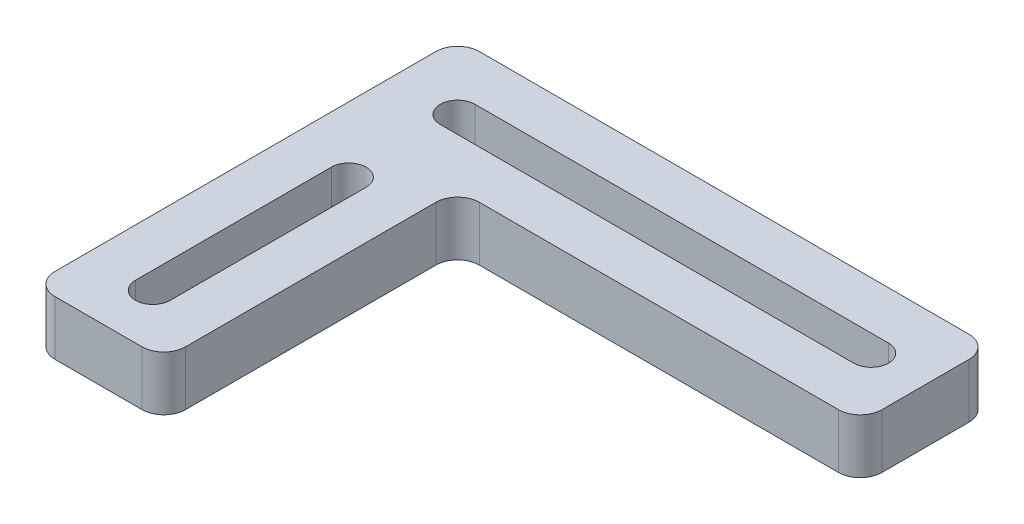
ISO-10303-21;
HEADER;
FILE_DESCRIPTION(('STEP AP214'),'2;1');
FILE_NAME('part.step','',(''),(''),'','','');
FILE_SCHEMA(('AUTOMOTIVE_DESIGN { 1 0 10303 214 1 1 1 1 }'));
ENDSEC;
DATA;
#1=APPLICATION_CONTEXT('core data for automotive mechanical design processes');
#2=APPLICATION_PROTOCOL_DEFINITION('international standard','automotive_design',2000,#1);
#3=PRODUCT_CONTEXT('',#1,'mechanical');
#4=PRODUCT('Part','Part','',(#3));
#5=PRODUCT_RELATED_PRODUCT_CATEGORY('part','',(#4));
#6=PRODUCT_DEFINITION_FORMATION('','',#4);
#7=PRODUCT_DEFINITION_CONTEXT('part definition',#1,'design');
#8=PRODUCT_DEFINITION('design','',#6,#7);
#9=PRODUCT_DEFINITION_SHAPE('','',#8);
#10=(LENGTH_UNIT() NAMED_UNIT(*) SI_UNIT(.MILLI.,.METRE.));
#11=(NAMED_UNIT(*) PLANE_ANGLE_UNIT() SI_UNIT($,.RADIAN.));
#12=(NAMED_UNIT(*) SI_UNIT($,.STERADIAN.) SOLID_ANGLE_UNIT());
#13=UNCERTAINTY_MEASURE_WITH_UNIT(LENGTH_MEASURE(1.E-05),#10,'distance_accuracy_value','');
#14=(GEOMETRIC_REPRESENTATION_CONTEXT(3) GLOBAL_UNCERTAINTY_ASSIGNED_CONTEXT((#13)) GLOBAL_UNIT_ASSIGNED_CONTEXT((#10,
#11,#12)) REPRESENTATION_CONTEXT('',''));
#15=CARTESIAN_POINT('',(0.,0.,0.));
#16=DIRECTION('',(0.,0.,1.));
#17=DIRECTION('',(1.,0.,0.));
#18=AXIS2_PLACEMENT_3D('',#15,#16,#17);
#19=CARTESIAN_POINT('',(0.,5.,-37.));
#20=DIRECTION('',(0.,0.,-1.));
#21=DIRECTION('',(-1.,0.,0.));
#22=AXIS2_PLACEMENT_3D('',#19,#20,#21);
#23=PLANE('',#22);
#24=DIRECTION('',(1.,0.,0.));
#25=VECTOR('',#24,1.);
#26=CARTESIAN_POINT('',(0.,0.,-37.));
#27=LINE('',#26,#25);
#28=CARTESIAN_POINT('',(0.,0.,-37.));
#29=VERTEX_POINT('',#28);
#30=CARTESIAN_POINT('',(45.,0.,-37.));
#31=VERTEX_POINT('',#30);
#32=EDGE_CURVE('E231',#29,#31,#27,.T.);
#33=ORIENTED_EDGE('',*,*,#32,.F.);
#34=DIRECTION('',(0.,-1.,0.));
#35=VECTOR('',#34,1.);
#36=CARTESIAN_POINT('',(0.,5.,-37.));
#37=LINE('',#36,#35);
#38=CARTESIAN_POINT('',(0.,5.,-37.));
#39=VERTEX_POINT('',#38);
#40=EDGE_CURVE('E11',#39,#29,#37,.T.);
#41=ORIENTED_EDGE('',*,*,#40,.F.);
#42=DIRECTION('',(1.,0.,0.));
#43=VECTOR('',#42,1.);
#44=CARTESIAN_POINT('',(0.,5.,-37.));
#45=LINE('',#44,#43);
#46=CARTESIAN_POINT('',(45.,5.,-37.));
#47=VERTEX_POINT('',#46);
#48=EDGE_CURVE('E332',#39,#47,#45,.T.);
#49=ORIENTED_EDGE('',*,*,#48,.T.);
#50=DIRECTION('',(0.,-1.,0.));
#51=VECTOR('',#50,1.);
#52=CARTESIAN_POINT('',(45.,5.,-37.));
#53=LINE('',#52,#51);
#54=EDGE_CURVE('E123',#47,#31,#53,.T.);
#55=ORIENTED_EDGE('',*,*,#54,.T.);
#56=EDGE_LOOP('',(#33,#41,#49,#55));
#57=FACE_BOUND('',#56,.T.);
#58=ADVANCED_FACE('F34',(#57),#23,.T.);
#59=CARTESIAN_POINT('',(0.,5.,-35.));
#60=DIRECTION('',(0.,-1.,0.));
#61=DIRECTION('',(0.,0.,-1.));
#62=AXIS2_PLACEMENT_3D('',#59,#60,#61);
#63=CYLINDRICAL_SURFACE('',#62,2.);
#64=CARTESIAN_POINT('',(0.,0.,-35.));
#65=DIRECTION('',(0.,1.,0.));
#66=DIRECTION('',(0.,0.,1.));
#67=AXIS2_PLACEMENT_3D('',#64,#65,#66);
#68=CIRCLE('',#67,2.);
#69=CARTESIAN_POINT('',(-1.99999999999999,0.,-35.));
#70=VERTEX_POINT('',#69);
#71=EDGE_CURVE('E234',#29,#70,#68,.T.);
#72=ORIENTED_EDGE('',*,*,#71,.T.);
#73=DIRECTION('',(0.,-1.,0.));
#74=VECTOR('',#73,1.);
#75=CARTESIAN_POINT('',(-1.99999999999999,5.,-35.));
#76=LINE('',#75,#74);
#77=CARTESIAN_POINT('',(-1.99999999999999,5.,-35.));
#78=VERTEX_POINT('',#77);
#79=EDGE_CURVE('E44',#78,#70,#76,.T.);
#80=ORIENTED_EDGE('',*,*,#79,.F.);
#81=CARTESIAN_POINT('',(0.,5.,-35.));
#82=DIRECTION('',(0.,1.,0.));
#83=DIRECTION('',(0.,0.,1.));
#84=AXIS2_PLACEMENT_3D('',#81,#82,#83);
#85=CIRCLE('',#84,2.);
#86=EDGE_CURVE('E334',#39,#78,#85,.T.);
#87=ORIENTED_EDGE('',*,*,#86,.F.);
#88=ORIENTED_EDGE('',*,*,#40,.T.);
#89=EDGE_LOOP('',(#72,#80,#87,#88));
#90=FACE_BOUND('',#89,.T.);
#91=ADVANCED_FACE('F364',(#90),#63,.T.);
#92=CARTESIAN_POINT('',(-1.99999999999999,5.,0.));
#93=DIRECTION('',(-1.,0.,0.));
#94=DIRECTION('',(0.,0.,1.));
#95=AXIS2_PLACEMENT_3D('',#92,#93,#94);
#96=PLANE('',#95);
#97=DIRECTION('',(0.,0.,-1.));
#98=VECTOR('',#97,1.);
#99=CARTESIAN_POINT('',(-1.99999999999999,0.,0.));
#100=LINE('',#99,#98);
#101=CARTESIAN_POINT('',(-1.99999999999999,0.,0.));
#102=VERTEX_POINT('',#101);
#103=EDGE_CURVE('E237',#102,#70,#100,.T.);
#104=ORIENTED_EDGE('',*,*,#103,.F.);
#105=DIRECTION('',(0.,-1.,0.));
#106=VECTOR('',#105,1.);
#107=CARTESIAN_POINT('',(-1.99999999999999,5.,0.));
#108=LINE('',#107,#106);
#109=CARTESIAN_POINT('',(-1.99999999999999,5.,0.));
#110=VERTEX_POINT('',#109);
#111=EDGE_CURVE('E280',#110,#102,#108,.T.);
#112=ORIENTED_EDGE('',*,*,#111,.F.);
#113=DIRECTION('',(0.,0.,-1.));
#114=VECTOR('',#113,1.);
#115=CARTESIAN_POINT('',(-1.99999999999999,5.,0.));
#116=LINE('',#115,#114);
#117=EDGE_CURVE('E336',#110,#78,#116,.T.);
#118=ORIENTED_EDGE('',*,*,#117,.T.);
#119=ORIENTED_EDGE('',*,*,#79,.T.);
#120=EDGE_LOOP('',(#104,#112,#118,#119));
#121=FACE_BOUND('',#120,.T.);
#122=ADVANCED_FACE('F367',(#121),#96,.T.);
#123=CARTESIAN_POINT('',(0.,5.,0.));
#124=DIRECTION('',(0.,-1.,0.));
#125=DIRECTION('',(0.,0.,-1.));
#126=AXIS2_PLACEMENT_3D('',#123,#124,#125);
#127=CYLINDRICAL_SURFACE('',#126,2.);
#128=CARTESIAN_POINT('',(0.,0.,0.));
#129=DIRECTION('',(0.,1.,0.));
#130=DIRECTION('',(0.,0.,1.));
#131=AXIS2_PLACEMENT_3D('',#128,#129,#130);
#132=CIRCLE('',#131,2.);
#133=CARTESIAN_POINT('',(0.,0.,2.));
#134=VERTEX_POINT('',#133);
#135=EDGE_CURVE('E240',#134,#102,#132,.F.);
#136=ORIENTED_EDGE('',*,*,#135,.F.);
#137=DIRECTION('',(0.,-1.,0.));
#138=VECTOR('',#137,1.);
#139=CARTESIAN_POINT('',(0.,5.,2.));
#140=LINE('',#139,#138);
#141=CARTESIAN_POINT('',(0.,5.,2.));
#142=VERTEX_POINT('',#141);
#143=EDGE_CURVE('E278',#142,#134,#140,.T.);
#144=ORIENTED_EDGE('',*,*,#143,.F.);
#145=CARTESIAN_POINT('',(0.,5.,0.));
#146=DIRECTION('',(0.,1.,0.));
#147=DIRECTION('',(0.,0.,1.));
#148=AXIS2_PLACEMENT_3D('',#145,#146,#147);
#149=CIRCLE('',#148,2.);
#150=EDGE_CURVE('E339',#142,#110,#149,.F.);
#151=ORIENTED_EDGE('',*,*,#150,.T.);
#152=ORIENTED_EDGE('',*,*,#111,.T.);
#153=EDGE_LOOP('',(#136,#144,#151,#152));
#154=FACE_BOUND('',#153,.T.);
#155=ADVANCED_FACE('F370',(#154),#127,.T.);
#156=CARTESIAN_POINT('',(0.,5.,2.));
#157=DIRECTION('',(0.,0.,-1.));
#158=DIRECTION('',(-1.,0.,0.));
#159=AXIS2_PLACEMENT_3D('',#156,#157,#158);
#160=PLANE('',#159);
#161=DIRECTION('',(1.,0.,0.));
#162=VECTOR('',#161,1.);
#163=CARTESIAN_POINT('',(0.,0.,2.));
#164=LINE('',#163,#162);
#165=CARTESIAN_POINT('',(8.,0.,2.));
#166=VERTEX_POINT('',#165);
#167=EDGE_CURVE('E243',#134,#166,#164,.T.);
#168=ORIENTED_EDGE('',*,*,#167,.T.);
#169=DIRECTION('',(0.,-1.,0.));
#170=VECTOR('',#169,1.);
#171=CARTESIAN_POINT('',(8.,5.,2.));
#172=LINE('',#171,#170);
#173=CARTESIAN_POINT('',(8.,5.,2.));
#174=VERTEX_POINT('',#173);
#175=EDGE_CURVE('E275',#174,#166,#172,.T.);
#176=ORIENTED_EDGE('',*,*,#175,.F.);
#177=DIRECTION('',(1.,0.,0.));
#178=VECTOR('',#177,1.);
#179=CARTESIAN_POINT('',(0.,5.,2.));
#180=LINE('',#179,#178);
#181=EDGE_CURVE('E342',#142,#174,#180,.T.);
#182=ORIENTED_EDGE('',*,*,#181,.F.);
#183=ORIENTED_EDGE('',*,*,#143,.T.);
#184=EDGE_LOOP('',(#168,#176,#182,#183));
#185=FACE_BOUND('',#184,.T.);
#186=ADVANCED_FACE('F375',(#185),#160,.F.);
#187=CARTESIAN_POINT('',(8.,5.,0.));
#188=DIRECTION('',(0.,-1.,0.));
#189=DIRECTION('',(0.,0.,-1.));
#190=AXIS2_PLACEMENT_3D('',#187,#188,#189);
#191=CYLINDRICAL_SURFACE('',#190,1.99999999999999);
#192=CARTESIAN_POINT('',(8.,0.,0.));
#193=DIRECTION('',(0.,1.,0.));
#194=DIRECTION('',(0.,0.,1.));
#195=AXIS2_PLACEMENT_3D('',#192,#193,#194);
#196=CIRCLE('',#195,1.99999999999999);
#197=CARTESIAN_POINT('',(9.99999999999999,0.,0.));
#198=VERTEX_POINT('',#197);
#199=EDGE_CURVE('E246',#166,#198,#196,.T.);
#200=ORIENTED_EDGE('',*,*,#199,.T.);
#201=DIRECTION('',(0.,-1.,0.));
#202=VECTOR('',#201,1.);
#203=CARTESIAN_POINT('',(9.99999999999999,5.,0.));
#204=LINE('',#203,#202);
#205=CARTESIAN_POINT('',(9.99999999999999,5.,0.));
#206=VERTEX_POINT('',#205);
#207=EDGE_CURVE('E272',#206,#198,#204,.T.);
#208=ORIENTED_EDGE('',*,*,#207,.F.);
#209=CARTESIAN_POINT('',(8.,5.,0.));
#210=DIRECTION('',(0.,1.,0.));
#211=DIRECTION('',(0.,0.,1.));
#212=AXIS2_PLACEMENT_3D('',#209,#210,#211);
#213=CIRCLE('',#212,1.99999999999999);
#214=EDGE_CURVE('E345',#174,#206,#213,.T.);
#215=ORIENTED_EDGE('',*,*,#214,.F.);
#216=ORIENTED_EDGE('',*,*,#175,.T.);
#217=EDGE_LOOP('',(#200,#208,#215,#216));
#218=FACE_BOUND('',#217,.T.);
#219=ADVANCED_FACE('F378',(#218),#191,.T.);
#220=CARTESIAN_POINT('',(9.99999999999999,5.,0.));
#221=DIRECTION('',(-1.,0.,0.));
#222=DIRECTION('',(0.,0.,1.));
#223=AXIS2_PLACEMENT_3D('',#220,#221,#222);
#224=PLANE('',#223);
#225=DIRECTION('',(0.,0.,-1.));
#226=VECTOR('',#225,1.);
#227=CARTESIAN_POINT('',(9.99999999999999,0.,0.));
#228=LINE('',#227,#226);
#229=CARTESIAN_POINT('',(9.99999999999999,0.,-23.));
#230=VERTEX_POINT('',#229);
#231=EDGE_CURVE('E249',#198,#230,#228,.T.);
#232=ORIENTED_EDGE('',*,*,#231,.T.);
#233=DIRECTION('',(0.,-1.,0.));
#234=VECTOR('',#233,1.);
#235=CARTESIAN_POINT('',(9.99999999999999,5.,-23.));
#236=LINE('',#235,#234);
#237=CARTESIAN_POINT('',(9.99999999999999,5.,-23.));
#238=VERTEX_POINT('',#237);
#239=EDGE_CURVE('E270',#238,#230,#236,.T.);
#240=ORIENTED_EDGE('',*,*,#239,.F.);
#241=DIRECTION('',(0.,0.,-1.));
#242=VECTOR('',#241,1.);
#243=CARTESIAN_POINT('',(9.99999999999999,5.,0.));
#244=LINE('',#243,#242);
#245=EDGE_CURVE('E348',#206,#238,#244,.T.);
#246=ORIENTED_EDGE('',*,*,#245,.F.);
#247=ORIENTED_EDGE('',*,*,#207,.T.);
#248=EDGE_LOOP('',(#232,#240,#246,#247));
#249=FACE_BOUND('',#248,.T.);
#250=ADVANCED_FACE('F380',(#249),#224,.F.);
#251=CARTESIAN_POINT('',(12.,5.,-23.));
#252=DIRECTION('',(0.,-1.,0.));
#253=DIRECTION('',(0.,0.,-1.));
#254=AXIS2_PLACEMENT_3D('',#251,#252,#253);
#255=CYLINDRICAL_SURFACE('',#254,2.);
#256=CARTESIAN_POINT('',(12.,0.,-23.));
#257=DIRECTION('',(0.,1.,0.));
#258=DIRECTION('',(0.,0.,1.));
#259=AXIS2_PLACEMENT_3D('',#256,#257,#258);
#260=CIRCLE('',#259,2.);
#261=CARTESIAN_POINT('',(12.,0.,-25.));
#262=VERTEX_POINT('',#261);
#263=EDGE_CURVE('E252',#262,#230,#260,.T.);
#264=ORIENTED_EDGE('',*,*,#263,.F.);
#265=DIRECTION('',(0.,-1.,0.));
#266=VECTOR('',#265,1.);
#267=CARTESIAN_POINT('',(12.,5.,-25.));
#268=LINE('',#267,#266);
#269=CARTESIAN_POINT('',(12.,5.,-25.));
#270=VERTEX_POINT('',#269);
#271=EDGE_CURVE('E268',#270,#262,#268,.T.);
#272=ORIENTED_EDGE('',*,*,#271,.F.);
#273=CARTESIAN_POINT('',(12.,5.,-23.));
#274=DIRECTION('',(0.,1.,0.));
#275=DIRECTION('',(0.,0.,1.));
#276=AXIS2_PLACEMENT_3D('',#273,#274,#275);
#277=CIRCLE('',#276,2.);
#278=EDGE_CURVE('E350',#270,#238,#277,.T.);
#279=ORIENTED_EDGE('',*,*,#278,.T.);
#280=ORIENTED_EDGE('',*,*,#239,.T.);
#281=EDGE_LOOP('',(#264,#272,#279,#280));
#282=FACE_BOUND('',#281,.T.);
#283=ADVANCED_FACE('F383',(#282),#255,.F.);
#284=CARTESIAN_POINT('',(0.,5.,-25.));
#285=DIRECTION('',(0.,0.,1.));
#286=DIRECTION('',(1.,0.,0.));
#287=AXIS2_PLACEMENT_3D('',#284,#285,#286);
#288=PLANE('',#287);
#289=DIRECTION('',(-1.,0.,0.));
#290=VECTOR('',#289,1.);
#291=CARTESIAN_POINT('',(0.,0.,-25.));
#292=LINE('',#291,#290);
#293=CARTESIAN_POINT('',(45.,0.,-25.));
#294=VERTEX_POINT('',#293);
#295=EDGE_CURVE('E255',#294,#262,#292,.T.);
#296=ORIENTED_EDGE('',*,*,#295,.F.);
#297=DIRECTION('',(0.,-1.,0.));
#298=VECTOR('',#297,1.);
#299=CARTESIAN_POINT('',(45.,5.,-25.));
#300=LINE('',#299,#298);
#301=CARTESIAN_POINT('',(45.,5.,-25.));
#302=VERTEX_POINT('',#301);
#303=EDGE_CURVE('E192',#302,#294,#300,.T.);
#304=ORIENTED_EDGE('',*,*,#303,.F.);
#305=DIRECTION('',(-1.,0.,0.));
#306=VECTOR('',#305,1.);
#307=CARTESIAN_POINT('',(0.,5.,-25.));
#308=LINE('',#307,#306);
#309=EDGE_CURVE('E199',#302,#270,#308,.T.);
#310=ORIENTED_EDGE('',*,*,#309,.T.);
#311=ORIENTED_EDGE('',*,*,#271,.T.);
#312=EDGE_LOOP('',(#296,#304,#310,#311));
#313=FACE_BOUND('',#312,.T.);
#314=ADVANCED_FACE('F354',(#313),#288,.T.);
#315=CARTESIAN_POINT('',(45.,5.,-27.));
#316=DIRECTION('',(0.,-1.,0.));
#317=DIRECTION('',(0.,0.,-1.));
#318=AXIS2_PLACEMENT_3D('',#315,#316,#317);
#319=CYLINDRICAL_SURFACE('',#318,2.);
#320=CARTESIAN_POINT('',(45.,0.,-27.));
#321=DIRECTION('',(0.,1.,0.));
#322=DIRECTION('',(0.,0.,1.));
#323=AXIS2_PLACEMENT_3D('',#320,#321,#322);
#324=CIRCLE('',#323,2.);
#325=CARTESIAN_POINT('',(47.,0.,-27.));
#326=VERTEX_POINT('',#325);
#327=EDGE_CURVE('E187',#326,#294,#324,.F.);
#328=ORIENTED_EDGE('',*,*,#327,.F.);
#329=DIRECTION('',(0.,-1.,0.));
#330=VECTOR('',#329,1.);
#331=CARTESIAN_POINT('',(47.,5.,-27.));
#332=LINE('',#331,#330);
#333=CARTESIAN_POINT('',(47.,5.,-27.));
#334=VERTEX_POINT('',#333);
#335=EDGE_CURVE('E182',#334,#326,#332,.T.);
#336=ORIENTED_EDGE('',*,*,#335,.F.);
#337=CARTESIAN_POINT('',(45.,5.,-27.));
#338=DIRECTION('',(0.,1.,0.));
#339=DIRECTION('',(0.,0.,1.));
#340=AXIS2_PLACEMENT_3D('',#337,#338,#339);
#341=CIRCLE('',#340,2.);
#342=EDGE_CURVE('E185',#334,#302,#341,.F.);
#343=ORIENTED_EDGE('',*,*,#342,.T.);
#344=ORIENTED_EDGE('',*,*,#303,.T.);
#345=EDGE_LOOP('',(#328,#336,#343,#344));
#346=FACE_BOUND('',#345,.T.);
#347=ADVANCED_FACE('F184',(#346),#319,.T.);
#348=CARTESIAN_POINT('',(47.,5.,0.));
#349=DIRECTION('',(1.,0.,0.));
#350=DIRECTION('',(0.,0.,-1.));
#351=AXIS2_PLACEMENT_3D('',#348,#349,#350);
#352=PLANE('',#351);
#353=DIRECTION('',(0.,0.,1.));
#354=VECTOR('',#353,1.);
#355=CARTESIAN_POINT('',(47.,0.,0.));
#356=LINE('',#355,#354);
#357=CARTESIAN_POINT('',(47.,0.,-35.));
#358=VERTEX_POINT('',#357);
#359=EDGE_CURVE('E259',#358,#326,#356,.T.);
#360=ORIENTED_EDGE('',*,*,#359,.F.);
#361=DIRECTION('',(0.,-1.,0.));
#362=VECTOR('',#361,1.);
#363=CARTESIAN_POINT('',(47.,5.,-35.));
#364=LINE('',#363,#362);
#365=CARTESIAN_POINT('',(47.,5.,-35.));
#366=VERTEX_POINT('',#365);
#367=EDGE_CURVE('E116',#366,#358,#364,.T.);
#368=ORIENTED_EDGE('',*,*,#367,.F.);
#369=DIRECTION('',(0.,0.,1.));
#370=VECTOR('',#369,1.);
#371=CARTESIAN_POINT('',(47.,5.,0.));
#372=LINE('',#371,#370);
#373=EDGE_CURVE('E196',#366,#334,#372,.T.);
#374=ORIENTED_EDGE('',*,*,#373,.T.);
#375=ORIENTED_EDGE('',*,*,#335,.T.);
#376=EDGE_LOOP('',(#360,#368,#374,#375));
#377=FACE_BOUND('',#376,.T.);
#378=ADVANCED_FACE('F201',(#377),#352,.T.);
#379=CARTESIAN_POINT('',(4.,5.,-21.));
#380=DIRECTION('',(0.,-1.,0.));
#381=DIRECTION('',(0.,0.,-1.));
#382=AXIS2_PLACEMENT_3D('',#379,#380,#381);
#383=CYLINDRICAL_SURFACE('',#382,1.6);
#384=CARTESIAN_POINT('',(4.,0.,-21.));
#385=DIRECTION('',(0.,1.,0.));
#386=DIRECTION('',(0.,0.,1.));
#387=AXIS2_PLACEMENT_3D('',#384,#385,#386);
#388=CIRCLE('',#387,1.6);
#389=CARTESIAN_POINT('',(5.6,0.,-21.));
#390=VERTEX_POINT('',#389);
#391=CARTESIAN_POINT('',(2.4,0.,-21.));
#392=VERTEX_POINT('',#391);
#393=EDGE_CURVE('E219',#390,#392,#388,.T.);
#394=ORIENTED_EDGE('',*,*,#393,.F.);
#395=DIRECTION('',(0.,-1.,0.));
#396=VECTOR('',#395,1.);
#397=CARTESIAN_POINT('',(5.6,5.,-21.));
#398=LINE('',#397,#396);
#399=CARTESIAN_POINT('',(5.6,5.,-21.));
#400=VERTEX_POINT('',#399);
#401=EDGE_CURVE('E265',#400,#390,#398,.T.);
#402=ORIENTED_EDGE('',*,*,#401,.F.);
#403=CARTESIAN_POINT('',(4.,5.,-21.));
#404=DIRECTION('',(0.,1.,0.));
#405=DIRECTION('',(0.,0.,1.));
#406=AXIS2_PLACEMENT_3D('',#403,#404,#405);
#407=CIRCLE('',#406,1.6);
#408=CARTESIAN_POINT('',(2.4,5.,-21.));
#409=VERTEX_POINT('',#408);
#410=EDGE_CURVE('E315',#400,#409,#407,.T.);
#411=ORIENTED_EDGE('',*,*,#410,.T.);
#412=DIRECTION('',(0.,-1.,0.));
#413=VECTOR('',#412,1.);
#414=CARTESIAN_POINT('',(2.4,5.,-21.));
#415=LINE('',#414,#413);
#416=EDGE_CURVE('E283',#409,#392,#415,.T.);
#417=ORIENTED_EDGE('',*,*,#416,.T.);
#418=EDGE_LOOP('',(#394,#402,#411,#417));
#419=FACE_BOUND('',#418,.T.);
#420=ADVANCED_FACE('F411',(#419),#383,.F.);
#421=CARTESIAN_POINT('',(5.6,5.,0.));
#422=DIRECTION('',(-1.,0.,0.));
#423=DIRECTION('',(0.,0.,1.));
#424=AXIS2_PLACEMENT_3D('',#421,#422,#423);
#425=PLANE('',#424);
#426=DIRECTION('',(0.,0.,-1.));
#427=VECTOR('',#426,1.);
#428=CARTESIAN_POINT('',(5.6,0.,0.));
#429=LINE('',#428,#427);
#430=CARTESIAN_POINT('',(5.6,0.,-3.));
#431=VERTEX_POINT('',#430);
#432=EDGE_CURVE('E222',#431,#390,#429,.T.);
#433=ORIENTED_EDGE('',*,*,#432,.F.);
#434=DIRECTION('',(0.,-1.,0.));
#435=VECTOR('',#434,1.);
#436=CARTESIAN_POINT('',(5.6,5.,-3.));
#437=LINE('',#436,#435);
#438=CARTESIAN_POINT('',(5.6,5.,-3.));
#439=VERTEX_POINT('',#438);
#440=EDGE_CURVE('E287',#439,#431,#437,.T.);
#441=ORIENTED_EDGE('',*,*,#440,.F.);
#442=DIRECTION('',(0.,0.,-1.));
#443=VECTOR('',#442,1.);
#444=CARTESIAN_POINT('',(5.6,5.,0.));
#445=LINE('',#444,#443);
#446=EDGE_CURVE('E324',#439,#400,#445,.T.);
#447=ORIENTED_EDGE('',*,*,#446,.T.);
#448=ORIENTED_EDGE('',*,*,#401,.T.);
#449=EDGE_LOOP('',(#433,#441,#447,#448));
#450=FACE_BOUND('',#449,.T.);
#451=ADVANCED_FACE('F407',(#450),#425,.T.);
#452=CARTESIAN_POINT('',(4.,5.,-3.));
#453=DIRECTION('',(0.,-1.,0.));
#454=DIRECTION('',(0.,0.,-1.));
#455=AXIS2_PLACEMENT_3D('',#452,#453,#454);
#456=CYLINDRICAL_SURFACE('',#455,1.6);
#457=CARTESIAN_POINT('',(4.,0.,-3.));
#458=DIRECTION('',(0.,1.,0.));
#459=DIRECTION('',(0.,0.,1.));
#460=AXIS2_PLACEMENT_3D('',#457,#458,#459);
#461=CIRCLE('',#460,1.6);
#462=CARTESIAN_POINT('',(2.4,0.,-3.));
#463=VERTEX_POINT('',#462);
#464=EDGE_CURVE('E225',#463,#431,#461,.T.);
#465=ORIENTED_EDGE('',*,*,#464,.F.);
#466=DIRECTION('',(0.,-1.,0.));
#467=VECTOR('',#466,1.);
#468=CARTESIAN_POINT('',(2.4,5.,-3.));
#469=LINE('',#468,#467);
#470=CARTESIAN_POINT('',(2.4,5.,-3.));
#471=VERTEX_POINT('',#470);
#472=EDGE_CURVE('E285',#471,#463,#469,.T.);
#473=ORIENTED_EDGE('',*,*,#472,.F.);
#474=CARTESIAN_POINT('',(4.,5.,-3.));
#475=DIRECTION('',(0.,1.,0.));
#476=DIRECTION('',(0.,0.,1.));
#477=AXIS2_PLACEMENT_3D('',#474,#475,#476);
#478=CIRCLE('',#477,1.6);
#479=EDGE_CURVE('E327',#471,#439,#478,.T.);
#480=ORIENTED_EDGE('',*,*,#479,.T.);
#481=ORIENTED_EDGE('',*,*,#440,.T.);
#482=EDGE_LOOP('',(#465,#473,#480,#481));
#483=FACE_BOUND('',#482,.T.);
#484=ADVANCED_FACE('F404',(#483),#456,.F.);
#485=CARTESIAN_POINT('',(4.00000000000001,5.,-31.));
#486=DIRECTION('',(0.,-1.,0.));
#487=DIRECTION('',(0.,0.,-1.));
#488=AXIS2_PLACEMENT_3D('',#485,#486,#487);
#489=CYLINDRICAL_SURFACE('',#488,1.6);
#490=CARTESIAN_POINT('',(4.00000000000001,0.,-31.));
#491=DIRECTION('',(0.,1.,0.));
#492=DIRECTION('',(0.,0.,1.));
#493=AXIS2_PLACEMENT_3D('',#490,#491,#492);
#494=CIRCLE('',#493,1.6);
#495=CARTESIAN_POINT('',(4.,0.,-32.6));
#496=VERTEX_POINT('',#495);
#497=CARTESIAN_POINT('',(4.00000000000001,0.,-29.4));
#498=VERTEX_POINT('',#497);
#499=EDGE_CURVE('E207',#496,#498,#494,.T.);
#500=ORIENTED_EDGE('',*,*,#499,.F.);
#501=DIRECTION('',(0.,-1.,0.));
#502=VECTOR('',#501,1.);
#503=CARTESIAN_POINT('',(4.,5.,-32.6));
#504=LINE('',#503,#502);
#505=CARTESIAN_POINT('',(4.,5.,-32.6));
#506=VERTEX_POINT('',#505);
#507=EDGE_CURVE('E38',#506,#496,#504,.T.);
#508=ORIENTED_EDGE('',*,*,#507,.F.);
#509=CARTESIAN_POINT('',(4.00000000000001,5.,-31.));
#510=DIRECTION('',(0.,1.,0.));
#511=DIRECTION('',(0.,0.,1.));
#512=AXIS2_PLACEMENT_3D('',#509,#510,#511);
#513=CIRCLE('',#512,1.6);
#514=CARTESIAN_POINT('',(4.00000000000001,5.,-29.4));
#515=VERTEX_POINT('',#514);
#516=EDGE_CURVE('E263',#506,#515,#513,.T.);
#517=ORIENTED_EDGE('',*,*,#516,.T.);
#518=DIRECTION('',(0.,-1.,0.));
#519=VECTOR('',#518,1.);
#520=CARTESIAN_POINT('',(4.00000000000001,5.,-29.4));
#521=LINE('',#520,#519);
#522=EDGE_CURVE('E203',#515,#498,#521,.T.);
#523=ORIENTED_EDGE('',*,*,#522,.T.);
#524=EDGE_LOOP('',(#500,#508,#517,#523));
#525=FACE_BOUND('',#524,.T.);
#526=ADVANCED_FACE('F36',(#525),#489,.F.);
#527=CARTESIAN_POINT('',(0.,5.,-32.6));
#528=DIRECTION('',(0.,0.,1.));
#529=DIRECTION('',(1.,0.,0.));
#530=AXIS2_PLACEMENT_3D('',#527,#528,#529);
#531=PLANE('',#530);
#532=DIRECTION('',(-1.,0.,0.));
#533=VECTOR('',#532,1.);
#534=CARTESIAN_POINT('',(0.,0.,-32.6));
#535=LINE('',#534,#533);
#536=CARTESIAN_POINT('',(42.,0.,-32.6));
#537=VERTEX_POINT('',#536);
#538=EDGE_CURVE('E210',#537,#496,#535,.T.);
#539=ORIENTED_EDGE('',*,*,#538,.F.);
#540=DIRECTION('',(0.,-1.,0.));
#541=VECTOR('',#540,1.);
#542=CARTESIAN_POINT('',(42.,5.,-32.6));
#543=LINE('',#542,#541);
#544=CARTESIAN_POINT('',(42.,5.,-32.6));
#545=VERTEX_POINT('',#544);
#546=EDGE_CURVE('E292',#545,#537,#543,.T.);
#547=ORIENTED_EDGE('',*,*,#546,.F.);
#548=DIRECTION('',(-1.,0.,0.));
#549=VECTOR('',#548,1.);
#550=CARTESIAN_POINT('',(0.,5.,-32.6));
#551=LINE('',#550,#549);
#552=EDGE_CURVE('E301',#545,#506,#551,.T.);
#553=ORIENTED_EDGE('',*,*,#552,.T.);
#554=ORIENTED_EDGE('',*,*,#507,.T.);
#555=EDGE_LOOP('',(#539,#547,#553,#554));
#556=FACE_BOUND('',#555,.T.);
#557=ADVANCED_FACE('F299',(#556),#531,.T.);
#558=CARTESIAN_POINT('',(42.,5.,-31.));
#559=DIRECTION('',(0.,-1.,0.));
#560=DIRECTION('',(0.,0.,-1.));
#561=AXIS2_PLACEMENT_3D('',#558,#559,#560);
#562=CYLINDRICAL_SURFACE('',#561,1.6);
#563=CARTESIAN_POINT('',(42.,0.,-31.));
#564=DIRECTION('',(0.,1.,0.));
#565=DIRECTION('',(0.,0.,1.));
#566=AXIS2_PLACEMENT_3D('',#563,#564,#565);
#567=CIRCLE('',#566,1.6);
#568=CARTESIAN_POINT('',(42.,0.,-29.4));
#569=VERTEX_POINT('',#568);
#570=EDGE_CURVE('E213',#569,#537,#567,.T.);
#571=ORIENTED_EDGE('',*,*,#570,.F.);
#572=DIRECTION('',(0.,-1.,0.));
#573=VECTOR('',#572,1.);
#574=CARTESIAN_POINT('',(42.,5.,-29.4));
#575=LINE('',#574,#573);
#576=CARTESIAN_POINT('',(42.,5.,-29.4));
#577=VERTEX_POINT('',#576);
#578=EDGE_CURVE('E291',#577,#569,#575,.T.);
#579=ORIENTED_EDGE('',*,*,#578,.F.);
#580=CARTESIAN_POINT('',(42.,5.,-31.));
#581=DIRECTION('',(0.,1.,0.));
#582=DIRECTION('',(0.,0.,1.));
#583=AXIS2_PLACEMENT_3D('',#580,#581,#582);
#584=CIRCLE('',#583,1.6);
#585=EDGE_CURVE('E310',#577,#545,#584,.T.);
#586=ORIENTED_EDGE('',*,*,#585,.T.);
#587=ORIENTED_EDGE('',*,*,#546,.T.);
#588=EDGE_LOOP('',(#571,#579,#586,#587));
#589=FACE_BOUND('',#588,.T.);
#590=ADVANCED_FACE('F307',(#589),#562,.F.);
#591=CARTESIAN_POINT('',(2.4,5.,0.));
#592=DIRECTION('',(-1.,0.,0.));
#593=DIRECTION('',(0.,0.,1.));
#594=AXIS2_PLACEMENT_3D('',#591,#592,#593);
#595=PLANE('',#594);
#596=DIRECTION('',(0.,0.,-1.));
#597=VECTOR('',#596,1.);
#598=CARTESIAN_POINT('',(2.4,0.,0.));
#599=LINE('',#598,#597);
#600=EDGE_CURVE('E228',#463,#392,#599,.T.);
#601=ORIENTED_EDGE('',*,*,#600,.T.);
#602=ORIENTED_EDGE('',*,*,#416,.F.);
#603=DIRECTION('',(0.,0.,-1.));
#604=VECTOR('',#603,1.);
#605=CARTESIAN_POINT('',(2.4,5.,0.));
#606=LINE('',#605,#604);
#607=EDGE_CURVE('E330',#471,#409,#606,.T.);
#608=ORIENTED_EDGE('',*,*,#607,.F.);
#609=ORIENTED_EDGE('',*,*,#472,.T.);
#610=EDGE_LOOP('',(#601,#602,#608,#609));
#611=FACE_BOUND('',#610,.T.);
#612=ADVANCED_FACE('F400',(#611),#595,.F.);
#613=CARTESIAN_POINT('',(0.,5.,-29.4));
#614=DIRECTION('',(0.,0.,1.));
#615=DIRECTION('',(1.,0.,0.));
#616=AXIS2_PLACEMENT_3D('',#613,#614,#615);
#617=PLANE('',#616);
#618=DIRECTION('',(-1.,0.,0.));
#619=VECTOR('',#618,1.);
#620=CARTESIAN_POINT('',(0.,0.,-29.4));
#621=LINE('',#620,#619);
#622=EDGE_CURVE('E216',#569,#498,#621,.T.);
#623=ORIENTED_EDGE('',*,*,#622,.T.);
#624=ORIENTED_EDGE('',*,*,#522,.F.);
#625=DIRECTION('',(-1.,0.,0.));
#626=VECTOR('',#625,1.);
#627=CARTESIAN_POINT('',(0.,5.,-29.4));
#628=LINE('',#627,#626);
#629=EDGE_CURVE('E312',#577,#515,#628,.T.);
#630=ORIENTED_EDGE('',*,*,#629,.F.);
#631=ORIENTED_EDGE('',*,*,#578,.T.);
#632=EDGE_LOOP('',(#623,#624,#630,#631));
#633=FACE_BOUND('',#632,.T.);
#634=ADVANCED_FACE('F313',(#633),#617,.F.);
#635=CARTESIAN_POINT('',(45.,5.,-35.));
#636=DIRECTION('',(0.,-1.,0.));
#637=DIRECTION('',(0.,0.,-1.));
#638=AXIS2_PLACEMENT_3D('',#635,#636,#637);
#639=CYLINDRICAL_SURFACE('',#638,1.99999999999999);
#640=CARTESIAN_POINT('',(45.,0.,-35.));
#641=DIRECTION('',(0.,1.,0.));
#642=DIRECTION('',(0.,0.,1.));
#643=AXIS2_PLACEMENT_3D('',#640,#641,#642);
#644=CIRCLE('',#643,1.99999999999999);
#645=EDGE_CURVE('E261',#358,#31,#644,.T.);
#646=ORIENTED_EDGE('',*,*,#645,.T.);
#647=ORIENTED_EDGE('',*,*,#54,.F.);
#648=CARTESIAN_POINT('',(45.,5.,-35.));
#649=DIRECTION('',(0.,1.,0.));
#650=DIRECTION('',(0.,0.,1.));
#651=AXIS2_PLACEMENT_3D('',#648,#649,#650);
#652=CIRCLE('',#651,1.99999999999999);
#653=EDGE_CURVE('E53',#366,#47,#652,.T.);
#654=ORIENTED_EDGE('',*,*,#653,.F.);
#655=ORIENTED_EDGE('',*,*,#367,.T.);
#656=EDGE_LOOP('',(#646,#647,#654,#655));
#657=FACE_BOUND('',#656,.T.);
#658=ADVANCED_FACE('F358',(#657),#639,.T.);
#659=CARTESIAN_POINT('',(0.,5.,0.));
#660=DIRECTION('',(0.,1.,0.));
#661=DIRECTION('',(0.,0.,1.));
#662=AXIS2_PLACEMENT_3D('',#659,#660,#661);
#663=PLANE('',#662);
#664=ORIENTED_EDGE('',*,*,#516,.F.);
#665=ORIENTED_EDGE('',*,*,#552,.F.);
#666=ORIENTED_EDGE('',*,*,#585,.F.);
#667=ORIENTED_EDGE('',*,*,#629,.T.);
#668=EDGE_LOOP('',(#664,#665,#666,#667));
#669=FACE_BOUND('',#668,.T.);
#670=ORIENTED_EDGE('',*,*,#410,.F.);
#671=ORIENTED_EDGE('',*,*,#446,.F.);
#672=ORIENTED_EDGE('',*,*,#479,.F.);
#673=ORIENTED_EDGE('',*,*,#607,.T.);
#674=EDGE_LOOP('',(#670,#671,#672,#673));
#675=FACE_BOUND('',#674,.T.);
#676=ORIENTED_EDGE('',*,*,#48,.F.);
#677=ORIENTED_EDGE('',*,*,#86,.T.);
#678=ORIENTED_EDGE('',*,*,#117,.F.);
#679=ORIENTED_EDGE('',*,*,#150,.F.);
#680=ORIENTED_EDGE('',*,*,#181,.T.);
#681=ORIENTED_EDGE('',*,*,#214,.T.);
#682=ORIENTED_EDGE('',*,*,#245,.T.);
#683=ORIENTED_EDGE('',*,*,#278,.F.);
#684=ORIENTED_EDGE('',*,*,#309,.F.);
#685=ORIENTED_EDGE('',*,*,#342,.F.);
#686=ORIENTED_EDGE('',*,*,#373,.F.);
#687=ORIENTED_EDGE('',*,*,#653,.T.);
#688=EDGE_LOOP('',(#676,#677,#678,#679,#680,#681,#682,#683,#684,#685,#686,#687));
#689=FACE_BOUND('',#688,.T.);
#690=ADVANCED_FACE('F195',(#669,#675,#689),#663,.T.);
#691=CARTESIAN_POINT('',(0.,0.,0.));
#692=DIRECTION('',(0.,1.,0.));
#693=DIRECTION('',(0.,0.,1.));
#694=AXIS2_PLACEMENT_3D('',#691,#692,#693);
#695=PLANE('',#694);
#696=ORIENTED_EDGE('',*,*,#499,.T.);
#697=ORIENTED_EDGE('',*,*,#622,.F.);
#698=ORIENTED_EDGE('',*,*,#570,.T.);
#699=ORIENTED_EDGE('',*,*,#538,.T.);
#700=EDGE_LOOP('',(#696,#697,#698,#699));
#701=FACE_BOUND('',#700,.T.);
#702=ORIENTED_EDGE('',*,*,#393,.T.);
#703=ORIENTED_EDGE('',*,*,#600,.F.);
#704=ORIENTED_EDGE('',*,*,#464,.T.);
#705=ORIENTED_EDGE('',*,*,#432,.T.);
#706=EDGE_LOOP('',(#702,#703,#704,#705));
#707=FACE_BOUND('',#706,.T.);
#708=ORIENTED_EDGE('',*,*,#32,.T.);
#709=ORIENTED_EDGE('',*,*,#645,.F.);
#710=ORIENTED_EDGE('',*,*,#359,.T.);
#711=ORIENTED_EDGE('',*,*,#327,.T.);
#712=ORIENTED_EDGE('',*,*,#295,.T.);
#713=ORIENTED_EDGE('',*,*,#263,.T.);
#714=ORIENTED_EDGE('',*,*,#231,.F.);
#715=ORIENTED_EDGE('',*,*,#199,.F.);
#716=ORIENTED_EDGE('',*,*,#167,.F.);
#717=ORIENTED_EDGE('',*,*,#135,.T.);
#718=ORIENTED_EDGE('',*,*,#103,.T.);
#719=ORIENTED_EDGE('',*,*,#71,.F.);
#720=EDGE_LOOP('',(#708,#709,#710,#711,#712,#713,#714,#715,#716,#717,#718,#719));
#721=FACE_BOUND('',#720,.T.);
#722=ADVANCED_FACE('F305',(#701,#707,#721),#695,.F.);
#723=CLOSED_SHELL('',(#58,#91,#122,#155,#186,#219,#250,#283,#314,#347,#378,#420,#451,#484,#526,
#557,#590,#612,#634,#658,#690,#722));
#724=MANIFOLD_SOLID_BREP('B2',#723);
#725=ADVANCED_BREP_SHAPE_REPRESENTATION('',(#18,#724),#14);
#726=SHAPE_DEFINITION_REPRESENTATION(#9,#725);
ENDSEC;
END-ISO-10303-21;
